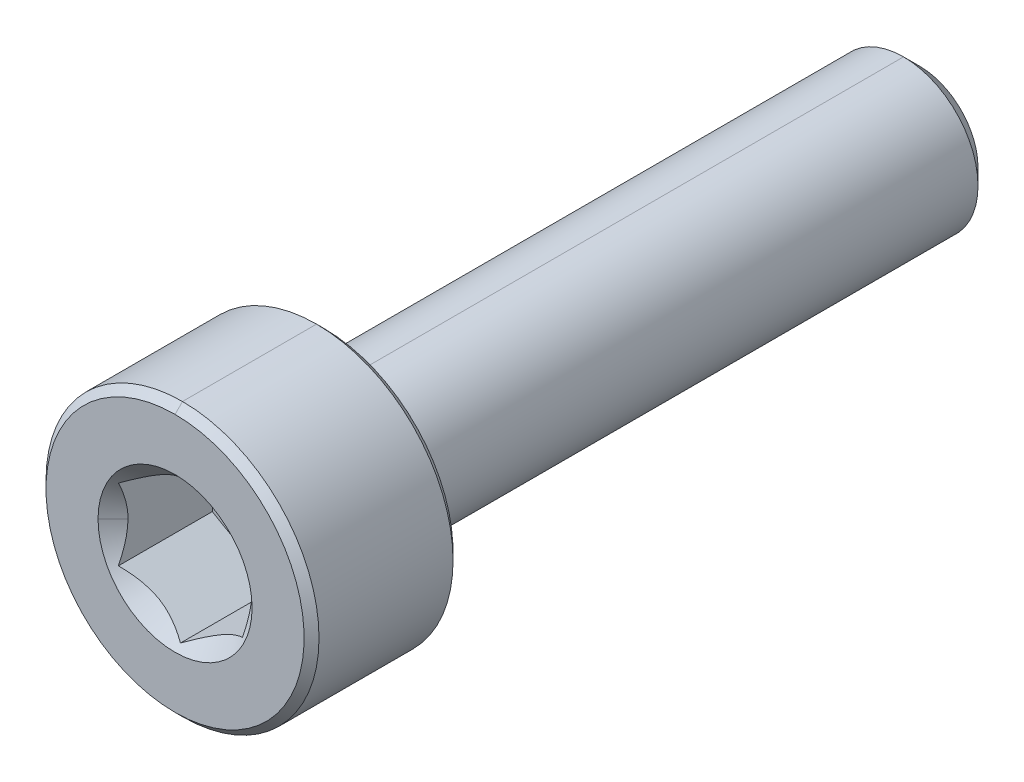
ISO-10303-21;
HEADER;
FILE_DESCRIPTION(('STEP AP214'),'2;1');
FILE_NAME('part.step','',(''),(''),'','','');
FILE_SCHEMA(('AUTOMOTIVE_DESIGN { 1 0 10303 214 1 1 1 1 }'));
ENDSEC;
DATA;
#1=APPLICATION_CONTEXT('core data for automotive mechanical design processes');
#2=APPLICATION_PROTOCOL_DEFINITION('international standard','automotive_design',2000,#1);
#3=PRODUCT_CONTEXT('',#1,'mechanical');
#4=PRODUCT('Part','Part','',(#3));
#5=PRODUCT_RELATED_PRODUCT_CATEGORY('part','',(#4));
#6=PRODUCT_DEFINITION_FORMATION('','',#4);
#7=PRODUCT_DEFINITION_CONTEXT('part definition',#1,'design');
#8=PRODUCT_DEFINITION('design','',#6,#7);
#9=PRODUCT_DEFINITION_SHAPE('','',#8);
#10=(LENGTH_UNIT() NAMED_UNIT(*) SI_UNIT(.MILLI.,.METRE.));
#11=(NAMED_UNIT(*) PLANE_ANGLE_UNIT() SI_UNIT($,.RADIAN.));
#12=(NAMED_UNIT(*) SI_UNIT($,.STERADIAN.) SOLID_ANGLE_UNIT());
#13=UNCERTAINTY_MEASURE_WITH_UNIT(LENGTH_MEASURE(1.E-05),#10,'distance_accuracy_value','');
#14=(GEOMETRIC_REPRESENTATION_CONTEXT(3) GLOBAL_UNCERTAINTY_ASSIGNED_CONTEXT((#13)) GLOBAL_UNIT_ASSIGNED_CONTEXT((#10,
#11,#12)) REPRESENTATION_CONTEXT('',''));
#15=CARTESIAN_POINT('',(0.,0.,0.));
#16=DIRECTION('',(0.,0.,1.));
#17=DIRECTION('',(1.,0.,0.));
#18=AXIS2_PLACEMENT_3D('',#15,#16,#17);
#19=CARTESIAN_POINT('',(1.25,-0.721687836487032,0.681186920870134));
#20=DIRECTION('',(1.,0.,0.));
#21=DIRECTION('',(0.,-1.,0.));
#22=AXIS2_PLACEMENT_3D('',#19,#20,#21);
#23=PLANE('',#22);
#24=DIRECTION('',(0.,0.,1.));
#25=VECTOR('',#24,1.);
#26=CARTESIAN_POINT('',(1.25,-0.721687836487032,0.681186920870134));
#27=LINE('',#26,#25);
#28=CARTESIAN_POINT('',(1.25,-0.721687836487032,5.5));
#29=VERTEX_POINT('',#28);
#30=CARTESIAN_POINT('',(1.25,-0.721687836487032,7.39174682452695));
#31=VERTEX_POINT('',#30);
#32=EDGE_CURVE('E281',#29,#31,#27,.T.);
#33=ORIENTED_EDGE('',*,*,#32,.T.);
#34=CARTESIAN_POINT('',(1.25,-0.721687836487032,7.39174682452694));
#35=CARTESIAN_POINT('',(1.25,-0.334936490538908,7.19837115155288));
#36=CARTESIAN_POINT('',(1.25,0.,7.19837115155288));
#37=B_SPLINE_CURVE_WITH_KNOTS('',2,(#34,#35,#36),.UNSPECIFIED.,.F.,.F.,(3,3),(0.,1.),.UNSPECIFIED.);
#38=CARTESIAN_POINT('',(1.25,0.,7.19837115155288));
#39=VERTEX_POINT('',#38);
#40=EDGE_CURVE('E338',#31,#39,#37,.T.);
#41=ORIENTED_EDGE('',*,*,#40,.T.);
#42=CARTESIAN_POINT('',(1.25,0.,7.19837115155288));
#43=CARTESIAN_POINT('',(1.25,0.18080910604686,7.19837115155288));
#44=CARTESIAN_POINT('',(1.25,0.371449563482302,7.25239368901567));
#45=CARTESIAN_POINT('',(1.25,0.53655435705269,7.29918008480977));
#46=CARTESIAN_POINT('',(1.25,0.721687836487032,7.39174682452694));
#47=B_SPLINE_CURVE_WITH_KNOTS('',2,(#42,#43,#44,#45,#46),.UNSPECIFIED.,.F.,.F.,(3,2,3),(0.,0.5,
1.),.UNSPECIFIED.);
#48=CARTESIAN_POINT('',(1.25,0.721687836487032,7.39174682452695));
#49=VERTEX_POINT('',#48);
#50=EDGE_CURVE('E550',#39,#49,#47,.T.);
#51=ORIENTED_EDGE('',*,*,#50,.T.);
#52=DIRECTION('',(0.,0.,1.));
#53=VECTOR('',#52,1.);
#54=CARTESIAN_POINT('',(1.25,0.721687836487032,0.681186920870134));
#55=LINE('',#54,#53);
#56=CARTESIAN_POINT('',(1.25,0.721687836487032,5.5));
#57=VERTEX_POINT('',#56);
#58=EDGE_CURVE('E10',#57,#49,#55,.T.);
#59=ORIENTED_EDGE('',*,*,#58,.F.);
#60=DIRECTION('',(0.,1.,0.));
#61=VECTOR('',#60,1.);
#62=CARTESIAN_POINT('',(1.25,-0.721687836487032,5.5));
#63=LINE('',#62,#61);
#64=EDGE_CURVE('E541',#29,#57,#63,.T.);
#65=ORIENTED_EDGE('',*,*,#64,.F.);
#66=EDGE_LOOP('',(#33,#41,#51,#59,#65));
#67=FACE_BOUND('',#66,.T.);
#68=ADVANCED_FACE('F16',(#67),#23,.F.);
#69=CARTESIAN_POINT('',(1.25,0.721687836487032,0.681186920870134));
#70=DIRECTION('',(0.5,0.866025403784439,0.));
#71=DIRECTION('',(0.,0.,-1.));
#72=AXIS2_PLACEMENT_3D('',#69,#70,#71);
#73=PLANE('',#72);
#74=ORIENTED_EDGE('',*,*,#58,.T.);
#75=CARTESIAN_POINT('',(1.25,0.721687836487032,7.39174682452694));
#76=CARTESIAN_POINT('',(0.916560687277689,0.914199113445662,7.19923554756831));
#77=CARTESIAN_POINT('',(0.627302735621754,1.08120226969946,7.19837397959836));
#78=CARTESIAN_POINT('',(0.336432191070494,1.24913645689546,7.19750760844711));
#79=CARTESIAN_POINT('',(0.,1.44337567297406,7.39174682452694));
#80=B_SPLINE_CURVE_WITH_KNOTS('',2,(#75,#76,#77,#78,#79),.UNSPECIFIED.,.F.,.F.,(3,2,3),(0.,0.5,
1.),.UNSPECIFIED.);
#81=CARTESIAN_POINT('',(0.,1.44337567297406,7.39174682452695));
#82=VERTEX_POINT('',#81);
#83=EDGE_CURVE('E564',#49,#82,#80,.T.);
#84=ORIENTED_EDGE('',*,*,#83,.T.);
#85=DIRECTION('',(0.,0.,1.));
#86=VECTOR('',#85,1.);
#87=CARTESIAN_POINT('',(0.,1.44337567297406,0.681186920870134));
#88=LINE('',#87,#86);
#89=CARTESIAN_POINT('',(0.,1.44337567297406,5.5));
#90=VERTEX_POINT('',#89);
#91=EDGE_CURVE('E29',#90,#82,#88,.T.);
#92=ORIENTED_EDGE('',*,*,#91,.F.);
#93=DIRECTION('',(-0.866025403784439,0.5,0.));
#94=VECTOR('',#93,1.);
#95=CARTESIAN_POINT('',(1.25,0.721687836487032,5.5));
#96=LINE('',#95,#94);
#97=EDGE_CURVE('E545',#57,#90,#96,.T.);
#98=ORIENTED_EDGE('',*,*,#97,.F.);
#99=EDGE_LOOP('',(#74,#84,#92,#98));
#100=FACE_BOUND('',#99,.T.);
#101=ADVANCED_FACE('F18',(#100),#73,.F.);
#102=CARTESIAN_POINT('',(0.,1.44337567297406,0.681186920870134));
#103=DIRECTION('',(-0.5,0.866025403784439,0.));
#104=DIRECTION('',(0.,0.,1.));
#105=AXIS2_PLACEMENT_3D('',#102,#103,#104);
#106=PLANE('',#105);
#107=ORIENTED_EDGE('',*,*,#91,.T.);
#108=CARTESIAN_POINT('',(0.,1.44337567297406,7.39174682452694));
#109=CARTESIAN_POINT('',(-0.333439312722313,1.25086439601543,7.19923554756831));
#110=CARTESIAN_POINT('',(-0.622697264378245,1.08386123976164,7.19837397959836));
#111=CARTESIAN_POINT('',(-0.913567808929512,0.915927052565634,7.19750760844711));
#112=CARTESIAN_POINT('',(-1.25,0.721687836487032,7.39174682452694));
#113=B_SPLINE_CURVE_WITH_KNOTS('',2,(#108,#109,#110,#111,#112),.UNSPECIFIED.,.F.,.F.,(3,2,3),
(0.,0.5,1.),.UNSPECIFIED.);
#114=CARTESIAN_POINT('',(-1.25,0.721687836487032,7.39174682452695));
#115=VERTEX_POINT('',#114);
#116=EDGE_CURVE('E185',#82,#115,#113,.T.);
#117=ORIENTED_EDGE('',*,*,#116,.T.);
#118=DIRECTION('',(0.,0.,1.));
#119=VECTOR('',#118,1.);
#120=CARTESIAN_POINT('',(-1.25,0.721687836487032,0.681186920870134));
#121=LINE('',#120,#119);
#122=CARTESIAN_POINT('',(-1.25,0.721687836487032,5.5));
#123=VERTEX_POINT('',#122);
#124=EDGE_CURVE('E54',#123,#115,#121,.T.);
#125=ORIENTED_EDGE('',*,*,#124,.F.);
#126=DIRECTION('',(-0.866025403784439,-0.5,0.));
#127=VECTOR('',#126,1.);
#128=CARTESIAN_POINT('',(0.,1.44337567297406,5.5));
#129=LINE('',#128,#127);
#130=EDGE_CURVE('E488',#90,#123,#129,.T.);
#131=ORIENTED_EDGE('',*,*,#130,.F.);
#132=EDGE_LOOP('',(#107,#117,#125,#131));
#133=FACE_BOUND('',#132,.T.);
#134=ADVANCED_FACE('F220',(#133),#106,.F.);
#135=CARTESIAN_POINT('',(-1.25,0.721687836487032,0.681186920870134));
#136=DIRECTION('',(-1.,0.,0.));
#137=DIRECTION('',(0.,1.,0.));
#138=AXIS2_PLACEMENT_3D('',#135,#136,#137);
#139=PLANE('',#138);
#140=ORIENTED_EDGE('',*,*,#124,.T.);
#141=CARTESIAN_POINT('',(-1.25,0.721687836487032,7.39174682452694));
#142=CARTESIAN_POINT('',(-1.25,0.538824359635312,7.30031508610108));
#143=CARTESIAN_POINT('',(-1.25,0.371449563482303,7.25239368901567));
#144=CARTESIAN_POINT('',(-1.25,0.18276534838339,7.19837115155288));
#145=CARTESIAN_POINT('',(-1.25,0.,7.19837115155288));
#146=B_SPLINE_CURVE_WITH_KNOTS('',2,(#141,#142,#143,#144,#145),.UNSPECIFIED.,.F.,.F.,(3,2,3),
(0.,0.5,1.),.UNSPECIFIED.);
#147=CARTESIAN_POINT('',(-1.25,0.,7.19837115155288));
#148=VERTEX_POINT('',#147);
#149=EDGE_CURVE('E174',#115,#148,#146,.T.);
#150=ORIENTED_EDGE('',*,*,#149,.T.);
#151=CARTESIAN_POINT('',(-1.25,0.,7.19837115155288));
#152=CARTESIAN_POINT('',(-1.25,-0.334936490538908,7.19837115155288));
#153=CARTESIAN_POINT('',(-1.25,-0.721687836487032,7.39174682452694));
#154=B_SPLINE_CURVE_WITH_KNOTS('',2,(#151,#152,#153),.UNSPECIFIED.,.F.,.F.,(3,3),(0.,1.),.UNSPECIFIED.);
#155=CARTESIAN_POINT('',(-1.25,-0.721687836487032,7.39174682452695));
#156=VERTEX_POINT('',#155);
#157=EDGE_CURVE('E179',#148,#156,#154,.T.);
#158=ORIENTED_EDGE('',*,*,#157,.T.);
#159=DIRECTION('',(0.,0.,1.));
#160=VECTOR('',#159,1.);
#161=CARTESIAN_POINT('',(-1.25,-0.721687836487032,0.681186920870134));
#162=LINE('',#161,#160);
#163=CARTESIAN_POINT('',(-1.25,-0.721687836487033,5.5));
#164=VERTEX_POINT('',#163);
#165=EDGE_CURVE('E43',#164,#156,#162,.T.);
#166=ORIENTED_EDGE('',*,*,#165,.F.);
#167=DIRECTION('',(0.,-1.,0.));
#168=VECTOR('',#167,1.);
#169=CARTESIAN_POINT('',(-1.25,0.721687836487032,5.5));
#170=LINE('',#169,#168);
#171=EDGE_CURVE('E484',#123,#164,#170,.T.);
#172=ORIENTED_EDGE('',*,*,#171,.F.);
#173=EDGE_LOOP('',(#140,#150,#158,#166,#172));
#174=FACE_BOUND('',#173,.T.);
#175=ADVANCED_FACE('F177',(#174),#139,.F.);
#176=CARTESIAN_POINT('',(-1.25,-0.721687836487032,0.681186920870134));
#177=DIRECTION('',(-0.5,-0.866025403784439,0.));
#178=DIRECTION('',(-0.866025403784439,0.5,0.));
#179=AXIS2_PLACEMENT_3D('',#176,#177,#178);
#180=PLANE('',#179);
#181=ORIENTED_EDGE('',*,*,#165,.T.);
#182=CARTESIAN_POINT('',(-1.25,-0.721687836487032,7.39174682452695));
#183=CARTESIAN_POINT('',(-0.916560687279091,-0.914199113444852,7.19923554756913));
#184=CARTESIAN_POINT('',(-0.627302735621754,-1.08120226969946,7.19837397959837));
#185=CARTESIAN_POINT('',(-0.336432191071902,-1.24913645689465,7.19750760844631));
#186=CARTESIAN_POINT('',(0.,-1.44337567297406,7.39174682452695));
#187=B_SPLINE_CURVE_WITH_KNOTS('',2,(#182,#183,#184,#185,#186),.UNSPECIFIED.,.F.,.F.,(3,2,3),
(0.,0.5,1.),.UNSPECIFIED.);
#188=CARTESIAN_POINT('',(0.,-1.44337567297406,7.39174682452695));
#189=VERTEX_POINT('',#188);
#190=EDGE_CURVE('E203',#156,#189,#187,.T.);
#191=ORIENTED_EDGE('',*,*,#190,.T.);
#192=DIRECTION('',(0.,0.,1.));
#193=VECTOR('',#192,1.);
#194=CARTESIAN_POINT('',(0.,-1.44337567297406,0.681186920870134));
#195=LINE('',#194,#193);
#196=CARTESIAN_POINT('',(0.,-1.44337567297406,5.5));
#197=VERTEX_POINT('',#196);
#198=EDGE_CURVE('E287',#197,#189,#195,.T.);
#199=ORIENTED_EDGE('',*,*,#198,.F.);
#200=DIRECTION('',(0.866025403784439,-0.5,0.));
#201=VECTOR('',#200,1.);
#202=CARTESIAN_POINT('',(-1.25,-0.721687836487032,5.5));
#203=LINE('',#202,#201);
#204=EDGE_CURVE('E297',#164,#197,#203,.T.);
#205=ORIENTED_EDGE('',*,*,#204,.F.);
#206=EDGE_LOOP('',(#181,#191,#199,#205));
#207=FACE_BOUND('',#206,.T.);
#208=ADVANCED_FACE('F219',(#207),#180,.F.);
#209=CARTESIAN_POINT('',(0.,-1.44337567297406,0.681186920870134));
#210=DIRECTION('',(0.5,-0.866025403784439,0.));
#211=DIRECTION('',(0.,0.,-1.));
#212=AXIS2_PLACEMENT_3D('',#209,#210,#211);
#213=PLANE('',#212);
#214=ORIENTED_EDGE('',*,*,#198,.T.);
#215=CARTESIAN_POINT('',(0.,-1.44337567297406,7.39174682452694));
#216=CARTESIAN_POINT('',(0.333439312720909,-1.25086439601624,7.19923554756912));
#217=CARTESIAN_POINT('',(0.622697264378245,-1.08386123976164,7.19837397959836));
#218=CARTESIAN_POINT('',(0.913567808928101,-0.915927052566449,7.1975076084463));
#219=CARTESIAN_POINT('',(1.25,-0.721687836487032,7.39174682452694));
#220=B_SPLINE_CURVE_WITH_KNOTS('',2,(#215,#216,#217,#218,#219),.UNSPECIFIED.,.F.,.F.,(3,2,3),
(0.,0.5,1.),.UNSPECIFIED.);
#221=EDGE_CURVE('E303',#189,#31,#220,.T.);
#222=ORIENTED_EDGE('',*,*,#221,.T.);
#223=ORIENTED_EDGE('',*,*,#32,.F.);
#224=DIRECTION('',(0.866025403784438,0.5,0.));
#225=VECTOR('',#224,1.);
#226=CARTESIAN_POINT('',(0.,-1.44337567297406,5.5));
#227=LINE('',#226,#225);
#228=EDGE_CURVE('E546',#197,#29,#227,.T.);
#229=ORIENTED_EDGE('',*,*,#228,.F.);
#230=EDGE_LOOP('',(#214,#222,#223,#229));
#231=FACE_BOUND('',#230,.T.);
#232=ADVANCED_FACE('F309',(#231),#213,.F.);
#233=CARTESIAN_POINT('',(0.,2.6,5.5));
#234=DIRECTION('',(0.,0.,-1.));
#235=DIRECTION('',(-1.,0.,0.));
#236=AXIS2_PLACEMENT_3D('',#233,#234,#235);
#237=PLANE('',#236);
#238=ORIENTED_EDGE('',*,*,#228,.T.);
#239=ORIENTED_EDGE('',*,*,#64,.T.);
#240=ORIENTED_EDGE('',*,*,#97,.T.);
#241=ORIENTED_EDGE('',*,*,#130,.T.);
#242=ORIENTED_EDGE('',*,*,#171,.T.);
#243=ORIENTED_EDGE('',*,*,#204,.T.);
#244=EDGE_LOOP('',(#238,#239,#240,#241,#242,#243));
#245=FACE_BOUND('',#244,.T.);
#246=ADVANCED_FACE('F247',(#245),#237,.F.);
#247=CARTESIAN_POINT('',(0.,0.,7.5));
#248=DIRECTION('',(0.,0.,1.));
#249=DIRECTION('',(1.,0.,0.));
#250=AXIS2_PLACEMENT_3D('',#247,#248,#249);
#251=CONICAL_SURFACE('',#250,1.55162884844712,0.78539816339745);
#252=DIRECTION('',(-0.707106781186549,0.,0.707106781186546));
#253=VECTOR('',#252,1.);
#254=CARTESIAN_POINT('',(-1.55162884844712,0.,7.5));
#255=LINE('',#254,#253);
#256=CARTESIAN_POINT('',(-1.55162884844712,0.,7.5));
#257=VERTEX_POINT('',#256);
#258=EDGE_CURVE('E190',#148,#257,#255,.T.);
#259=ORIENTED_EDGE('',*,*,#258,.F.);
#260=ORIENTED_EDGE('',*,*,#149,.F.);
#261=ORIENTED_EDGE('',*,*,#116,.F.);
#262=ORIENTED_EDGE('',*,*,#83,.F.);
#263=ORIENTED_EDGE('',*,*,#50,.F.);
#264=DIRECTION('',(0.707106781186549,0.,0.707106781186546));
#265=VECTOR('',#264,1.);
#266=CARTESIAN_POINT('',(1.55162884844712,0.,7.5));
#267=LINE('',#266,#265);
#268=CARTESIAN_POINT('',(1.55162884844712,0.,7.5));
#269=VERTEX_POINT('',#268);
#270=EDGE_CURVE('E456',#39,#269,#267,.T.);
#271=ORIENTED_EDGE('',*,*,#270,.T.);
#272=CARTESIAN_POINT('',(0.,0.,7.5));
#273=DIRECTION('',(0.,0.,1.));
#274=DIRECTION('',(1.,0.,0.));
#275=AXIS2_PLACEMENT_3D('',#272,#273,#274);
#276=CIRCLE('',#275,1.55162884844712);
#277=EDGE_CURVE('E186',#269,#257,#276,.T.);
#278=ORIENTED_EDGE('',*,*,#277,.T.);
#279=EDGE_LOOP('',(#259,#260,#261,#262,#263,#271,#278));
#280=FACE_BOUND('',#279,.T.);
#281=ADVANCED_FACE('F191',(#280),#251,.F.);
#282=CARTESIAN_POINT('',(0.,0.,7.5));
#283=DIRECTION('',(0.,0.,1.));
#284=DIRECTION('',(0.,-1.,0.));
#285=AXIS2_PLACEMENT_3D('',#282,#283,#284);
#286=PLANE('',#285);
#287=ORIENTED_EDGE('',*,*,#277,.F.);
#288=CARTESIAN_POINT('',(0.,0.,7.5));
#289=DIRECTION('',(0.,0.,1.));
#290=DIRECTION('',(1.,0.,0.));
#291=AXIS2_PLACEMENT_3D('',#288,#289,#290);
#292=CIRCLE('',#291,1.55162884844712);
#293=EDGE_CURVE('E197',#257,#269,#292,.T.);
#294=ORIENTED_EDGE('',*,*,#293,.F.);
#295=EDGE_LOOP('',(#287,#294));
#296=FACE_BOUND('',#295,.T.);
#297=CARTESIAN_POINT('',(0.,0.,7.5));
#298=DIRECTION('',(0.,0.,-1.));
#299=DIRECTION('',(0.,1.,0.));
#300=AXIS2_PLACEMENT_3D('',#297,#298,#299);
#301=CIRCLE('',#300,2.6);
#302=CARTESIAN_POINT('',(0.,2.6,7.5));
#303=VERTEX_POINT('',#302);
#304=CARTESIAN_POINT('',(0.,-2.6,7.5));
#305=VERTEX_POINT('',#304);
#306=EDGE_CURVE('E444',#303,#305,#301,.T.);
#307=ORIENTED_EDGE('',*,*,#306,.F.);
#308=CARTESIAN_POINT('',(0.,0.,7.5));
#309=DIRECTION('',(0.,0.,-1.));
#310=DIRECTION('',(0.,1.,0.));
#311=AXIS2_PLACEMENT_3D('',#308,#309,#310);
#312=CIRCLE('',#311,2.6);
#313=EDGE_CURVE('E491',#305,#303,#312,.T.);
#314=ORIENTED_EDGE('',*,*,#313,.F.);
#315=EDGE_LOOP('',(#307,#314));
#316=FACE_BOUND('',#315,.T.);
#317=ADVANCED_FACE('F246',(#296,#316),#286,.T.);
#318=CARTESIAN_POINT('',(0.,0.,7.35));
#319=DIRECTION('',(0.,0.,-1.));
#320=DIRECTION('',(0.,1.,0.));
#321=AXIS2_PLACEMENT_3D('',#318,#319,#320);
#322=CONICAL_SURFACE('',#321,2.75,0.785398163397446);
#323=DIRECTION('',(0.,-0.707106781186546,-0.70710678118655));
#324=VECTOR('',#323,1.);
#325=CARTESIAN_POINT('',(0.,-2.75,7.35));
#326=LINE('',#325,#324);
#327=CARTESIAN_POINT('',(0.,-2.75,7.35));
#328=VERTEX_POINT('',#327);
#329=EDGE_CURVE('E439',#305,#328,#326,.T.);
#330=ORIENTED_EDGE('',*,*,#329,.F.);
#331=ORIENTED_EDGE('',*,*,#313,.T.);
#332=DIRECTION('',(0.,0.707106781186546,-0.70710678118655));
#333=VECTOR('',#332,1.);
#334=CARTESIAN_POINT('',(0.,2.75,7.35));
#335=LINE('',#334,#333);
#336=CARTESIAN_POINT('',(0.,2.75,7.35));
#337=VERTEX_POINT('',#336);
#338=EDGE_CURVE('E430',#303,#337,#335,.T.);
#339=ORIENTED_EDGE('',*,*,#338,.T.);
#340=CARTESIAN_POINT('',(0.,0.,7.35));
#341=DIRECTION('',(0.,0.,-1.));
#342=DIRECTION('',(0.,1.,0.));
#343=AXIS2_PLACEMENT_3D('',#340,#341,#342);
#344=CIRCLE('',#343,2.75);
#345=EDGE_CURVE('E423',#328,#337,#344,.T.);
#346=ORIENTED_EDGE('',*,*,#345,.F.);
#347=EDGE_LOOP('',(#330,#331,#339,#346));
#348=FACE_BOUND('',#347,.T.);
#349=ADVANCED_FACE('F369',(#348),#322,.T.);
#350=CARTESIAN_POINT('',(0.,0.,-7.5));
#351=DIRECTION('',(0.,0.,-1.));
#352=DIRECTION('',(0.,1.,0.));
#353=AXIS2_PLACEMENT_3D('',#350,#351,#352);
#354=CYLINDRICAL_SURFACE('',#353,2.75);
#355=DIRECTION('',(0.,0.,-1.));
#356=VECTOR('',#355,1.);
#357=CARTESIAN_POINT('',(0.,-2.75,-7.5));
#358=LINE('',#357,#356);
#359=CARTESIAN_POINT('',(0.,-2.75,4.65));
#360=VERTEX_POINT('',#359);
#361=EDGE_CURVE('E420',#328,#360,#358,.T.);
#362=ORIENTED_EDGE('',*,*,#361,.F.);
#363=ORIENTED_EDGE('',*,*,#345,.T.);
#364=DIRECTION('',(0.,0.,-1.));
#365=VECTOR('',#364,1.);
#366=CARTESIAN_POINT('',(0.,2.75,-7.5));
#367=LINE('',#366,#365);
#368=CARTESIAN_POINT('',(0.,2.75,4.65));
#369=VERTEX_POINT('',#368);
#370=EDGE_CURVE('E435',#337,#369,#367,.T.);
#371=ORIENTED_EDGE('',*,*,#370,.T.);
#372=CARTESIAN_POINT('',(0.,0.,4.65));
#373=DIRECTION('',(0.,0.,-1.));
#374=DIRECTION('',(0.,1.,0.));
#375=AXIS2_PLACEMENT_3D('',#372,#373,#374);
#376=CIRCLE('',#375,2.75);
#377=EDGE_CURVE('E425',#360,#369,#376,.T.);
#378=ORIENTED_EDGE('',*,*,#377,.F.);
#379=EDGE_LOOP('',(#362,#363,#371,#378));
#380=FACE_BOUND('',#379,.T.);
#381=ADVANCED_FACE('F372',(#380),#354,.T.);
#382=CARTESIAN_POINT('',(0.,0.,4.5));
#383=DIRECTION('',(0.,0.,1.));
#384=DIRECTION('',(0.,-1.,0.));
#385=AXIS2_PLACEMENT_3D('',#382,#383,#384);
#386=CONICAL_SURFACE('',#385,2.6,0.785398163397451);
#387=DIRECTION('',(0.,0.70710678118655,0.707106781186546));
#388=VECTOR('',#387,1.);
#389=CARTESIAN_POINT('',(0.,2.6,4.5));
#390=LINE('',#389,#388);
#391=CARTESIAN_POINT('',(0.,2.6,4.5));
#392=VERTEX_POINT('',#391);
#393=EDGE_CURVE('E468',#392,#369,#390,.T.);
#394=ORIENTED_EDGE('',*,*,#393,.F.);
#395=CARTESIAN_POINT('',(0.,0.,4.5));
#396=DIRECTION('',(0.,0.,-1.));
#397=DIRECTION('',(0.,1.,0.));
#398=AXIS2_PLACEMENT_3D('',#395,#396,#397);
#399=CIRCLE('',#398,2.6);
#400=CARTESIAN_POINT('',(0.,-2.6,4.5));
#401=VERTEX_POINT('',#400);
#402=EDGE_CURVE('E521',#401,#392,#399,.T.);
#403=ORIENTED_EDGE('',*,*,#402,.F.);
#404=DIRECTION('',(0.,-0.70710678118655,0.707106781186546));
#405=VECTOR('',#404,1.);
#406=CARTESIAN_POINT('',(0.,-2.6,4.5));
#407=LINE('',#406,#405);
#408=EDGE_CURVE('E472',#401,#360,#407,.T.);
#409=ORIENTED_EDGE('',*,*,#408,.T.);
#410=ORIENTED_EDGE('',*,*,#377,.T.);
#411=EDGE_LOOP('',(#394,#403,#409,#410));
#412=FACE_BOUND('',#411,.T.);
#413=ADVANCED_FACE('F248',(#412),#386,.T.);
#414=CARTESIAN_POINT('',(0.,2.6,4.5));
#415=DIRECTION('',(0.,0.,-1.));
#416=DIRECTION('',(-1.,0.,0.));
#417=AXIS2_PLACEMENT_3D('',#414,#415,#416);
#418=PLANE('',#417);
#419=CARTESIAN_POINT('',(0.,0.,4.5));
#420=DIRECTION('',(0.,0.,-1.));
#421=DIRECTION('',(0.,1.,0.));
#422=AXIS2_PLACEMENT_3D('',#419,#420,#421);
#423=CIRCLE('',#422,1.65);
#424=CARTESIAN_POINT('',(0.,1.65,4.5));
#425=VERTEX_POINT('',#424);
#426=CARTESIAN_POINT('',(0.,-1.65,4.5));
#427=VERTEX_POINT('',#426);
#428=EDGE_CURVE('E465',#425,#427,#423,.T.);
#429=ORIENTED_EDGE('',*,*,#428,.F.);
#430=CARTESIAN_POINT('',(0.,0.,4.5));
#431=DIRECTION('',(0.,0.,-1.));
#432=DIRECTION('',(0.,1.,0.));
#433=AXIS2_PLACEMENT_3D('',#430,#431,#432);
#434=CIRCLE('',#433,1.65);
#435=EDGE_CURVE('E506',#427,#425,#434,.T.);
#436=ORIENTED_EDGE('',*,*,#435,.F.);
#437=EDGE_LOOP('',(#429,#436));
#438=FACE_BOUND('',#437,.T.);
#439=ORIENTED_EDGE('',*,*,#402,.T.);
#440=CARTESIAN_POINT('',(0.,0.,4.5));
#441=DIRECTION('',(0.,0.,-1.));
#442=DIRECTION('',(0.,1.,0.));
#443=AXIS2_PLACEMENT_3D('',#440,#441,#442);
#444=CIRCLE('',#443,2.6);
#445=EDGE_CURVE('E473',#392,#401,#444,.T.);
#446=ORIENTED_EDGE('',*,*,#445,.T.);
#447=EDGE_LOOP('',(#439,#446));
#448=FACE_BOUND('',#447,.T.);
#449=ADVANCED_FACE('F407',(#438,#448),#418,.T.);
#450=CARTESIAN_POINT('',(0.,0.,4.35));
#451=DIRECTION('',(0.,0.,-1.));
#452=DIRECTION('',(0.,1.,0.));
#453=AXIS2_PLACEMENT_3D('',#450,#451,#452);
#454=TOROIDAL_SURFACE('',#453,1.65,0.15);
#455=CARTESIAN_POINT('',(0.,-1.65,4.35));
#456=DIRECTION('',(1.,0.,0.));
#457=DIRECTION('',(0.,1.,0.));
#458=AXIS2_PLACEMENT_3D('',#455,#456,#457);
#459=CIRCLE('',#458,0.15);
#460=CARTESIAN_POINT('',(0.,-1.5,4.35));
#461=VERTEX_POINT('',#460);
#462=EDGE_CURVE('E502',#461,#427,#459,.T.);
#463=ORIENTED_EDGE('',*,*,#462,.F.);
#464=CARTESIAN_POINT('',(0.,0.,4.35));
#465=DIRECTION('',(0.,0.,-1.));
#466=DIRECTION('',(0.,1.,0.));
#467=AXIS2_PLACEMENT_3D('',#464,#465,#466);
#468=CIRCLE('',#467,1.5);
#469=CARTESIAN_POINT('',(0.,1.5,4.35));
#470=VERTEX_POINT('',#469);
#471=EDGE_CURVE('E462',#470,#461,#468,.T.);
#472=ORIENTED_EDGE('',*,*,#471,.F.);
#473=CARTESIAN_POINT('',(0.,1.65,4.35));
#474=DIRECTION('',(-1.,0.,0.));
#475=DIRECTION('',(0.,0.,1.));
#476=AXIS2_PLACEMENT_3D('',#473,#474,#475);
#477=CIRCLE('',#476,0.15);
#478=EDGE_CURVE('E510',#470,#425,#477,.T.);
#479=ORIENTED_EDGE('',*,*,#478,.T.);
#480=ORIENTED_EDGE('',*,*,#428,.T.);
#481=EDGE_LOOP('',(#463,#472,#479,#480));
#482=FACE_BOUND('',#481,.T.);
#483=ADVANCED_FACE('F403',(#482),#454,.F.);
#484=CARTESIAN_POINT('',(0.,0.,-7.5));
#485=DIRECTION('',(0.,0.,-1.));
#486=DIRECTION('',(0.,1.,0.));
#487=AXIS2_PLACEMENT_3D('',#484,#485,#486);
#488=CYLINDRICAL_SURFACE('',#487,1.5);
#489=DIRECTION('',(0.,0.,-1.));
#490=VECTOR('',#489,1.);
#491=CARTESIAN_POINT('',(0.,-1.5,-7.5));
#492=LINE('',#491,#490);
#493=CARTESIAN_POINT('',(0.,-1.5,-7.17524047358084));
#494=VERTEX_POINT('',#493);
#495=EDGE_CURVE('E457',#461,#494,#492,.T.);
#496=ORIENTED_EDGE('',*,*,#495,.F.);
#497=CARTESIAN_POINT('',(0.,0.,4.35));
#498=DIRECTION('',(0.,0.,-1.));
#499=DIRECTION('',(0.,1.,0.));
#500=AXIS2_PLACEMENT_3D('',#497,#498,#499);
#501=CIRCLE('',#500,1.5);
#502=EDGE_CURVE('E498',#461,#470,#501,.T.);
#503=ORIENTED_EDGE('',*,*,#502,.T.);
#504=DIRECTION('',(0.,0.,-1.));
#505=VECTOR('',#504,1.);
#506=CARTESIAN_POINT('',(0.,1.5,-7.5));
#507=LINE('',#506,#505);
#508=CARTESIAN_POINT('',(0.,1.5,-7.17524047358084));
#509=VERTEX_POINT('',#508);
#510=EDGE_CURVE('E495',#470,#509,#507,.T.);
#511=ORIENTED_EDGE('',*,*,#510,.T.);
#512=CARTESIAN_POINT('',(0.,0.,-7.17524047358084));
#513=DIRECTION('',(0.,0.,-1.));
#514=DIRECTION('',(0.,1.,0.));
#515=AXIS2_PLACEMENT_3D('',#512,#513,#514);
#516=CIRCLE('',#515,1.5);
#517=EDGE_CURVE('E463',#494,#509,#516,.T.);
#518=ORIENTED_EDGE('',*,*,#517,.F.);
#519=EDGE_LOOP('',(#496,#503,#511,#518));
#520=FACE_BOUND('',#519,.T.);
#521=ADVANCED_FACE('F399',(#520),#488,.T.);
#522=CARTESIAN_POINT('',(0.,0.,-7.5));
#523=DIRECTION('',(0.,0.,1.));
#524=DIRECTION('',(0.,-1.,0.));
#525=AXIS2_PLACEMENT_3D('',#522,#523,#524);
#526=CONICAL_SURFACE('',#525,1.17524047358084,0.785398163397448);
#527=DIRECTION('',(0.,0.707106781186547,0.707106781186549));
#528=VECTOR('',#527,1.);
#529=CARTESIAN_POINT('',(0.,1.17524047358084,-7.5));
#530=LINE('',#529,#528);
#531=CARTESIAN_POINT('',(0.,1.17524047358084,-7.5));
#532=VERTEX_POINT('',#531);
#533=EDGE_CURVE('E529',#532,#509,#530,.T.);
#534=ORIENTED_EDGE('',*,*,#533,.F.);
#535=CARTESIAN_POINT('',(0.,0.,-7.5));
#536=DIRECTION('',(0.,0.,-1.));
#537=DIRECTION('',(0.,1.,0.));
#538=AXIS2_PLACEMENT_3D('',#535,#536,#537);
#539=CIRCLE('',#538,1.17524047358084);
#540=CARTESIAN_POINT('',(0.,-1.17524047358084,-7.5));
#541=VERTEX_POINT('',#540);
#542=EDGE_CURVE('E466',#541,#532,#539,.T.);
#543=ORIENTED_EDGE('',*,*,#542,.F.);
#544=DIRECTION('',(0.,-0.707106781186547,0.707106781186549));
#545=VECTOR('',#544,1.);
#546=CARTESIAN_POINT('',(0.,-1.17524047358084,-7.5));
#547=LINE('',#546,#545);
#548=EDGE_CURVE('E452',#541,#494,#547,.T.);
#549=ORIENTED_EDGE('',*,*,#548,.T.);
#550=ORIENTED_EDGE('',*,*,#517,.T.);
#551=EDGE_LOOP('',(#534,#543,#549,#550));
#552=FACE_BOUND('',#551,.T.);
#553=ADVANCED_FACE('F395',(#552),#526,.T.);
#554=CARTESIAN_POINT('',(0.,1.17524047358084,-7.5));
#555=DIRECTION('',(0.,0.,-1.));
#556=DIRECTION('',(-1.,0.,0.));
#557=AXIS2_PLACEMENT_3D('',#554,#555,#556);
#558=PLANE('',#557);
#559=ORIENTED_EDGE('',*,*,#542,.T.);
#560=CARTESIAN_POINT('',(0.,0.,-7.5));
#561=DIRECTION('',(0.,0.,-1.));
#562=DIRECTION('',(0.,1.,0.));
#563=AXIS2_PLACEMENT_3D('',#560,#561,#562);
#564=CIRCLE('',#563,1.17524047358084);
#565=EDGE_CURVE('E525',#532,#541,#564,.T.);
#566=ORIENTED_EDGE('',*,*,#565,.T.);
#567=EDGE_LOOP('',(#559,#566));
#568=FACE_BOUND('',#567,.T.);
#569=ADVANCED_FACE('F391',(#568),#558,.T.);
#570=CARTESIAN_POINT('',(0.,0.,-7.5));
#571=DIRECTION('',(0.,0.,1.));
#572=DIRECTION('',(0.,-1.,0.));
#573=AXIS2_PLACEMENT_3D('',#570,#571,#572);
#574=CONICAL_SURFACE('',#573,1.17524047358084,0.785398163397448);
#575=ORIENTED_EDGE('',*,*,#565,.F.);
#576=ORIENTED_EDGE('',*,*,#533,.T.);
#577=CARTESIAN_POINT('',(0.,0.,-7.17524047358084));
#578=DIRECTION('',(0.,0.,-1.));
#579=DIRECTION('',(0.,1.,0.));
#580=AXIS2_PLACEMENT_3D('',#577,#578,#579);
#581=CIRCLE('',#580,1.5);
#582=EDGE_CURVE('E461',#509,#494,#581,.T.);
#583=ORIENTED_EDGE('',*,*,#582,.T.);
#584=ORIENTED_EDGE('',*,*,#548,.F.);
#585=EDGE_LOOP('',(#575,#576,#583,#584));
#586=FACE_BOUND('',#585,.T.);
#587=ADVANCED_FACE('F381',(#586),#574,.T.);
#588=CARTESIAN_POINT('',(0.,0.,-7.5));
#589=DIRECTION('',(0.,0.,-1.));
#590=DIRECTION('',(0.,1.,0.));
#591=AXIS2_PLACEMENT_3D('',#588,#589,#590);
#592=CYLINDRICAL_SURFACE('',#591,1.5);
#593=ORIENTED_EDGE('',*,*,#471,.T.);
#594=ORIENTED_EDGE('',*,*,#495,.T.);
#595=ORIENTED_EDGE('',*,*,#582,.F.);
#596=ORIENTED_EDGE('',*,*,#510,.F.);
#597=EDGE_LOOP('',(#593,#594,#595,#596));
#598=FACE_BOUND('',#597,.T.);
#599=ADVANCED_FACE('F378',(#598),#592,.T.);
#600=CARTESIAN_POINT('',(0.,0.,4.35));
#601=DIRECTION('',(0.,0.,-1.));
#602=DIRECTION('',(0.,1.,0.));
#603=AXIS2_PLACEMENT_3D('',#600,#601,#602);
#604=TOROIDAL_SURFACE('',#603,1.65,0.15);
#605=ORIENTED_EDGE('',*,*,#502,.F.);
#606=ORIENTED_EDGE('',*,*,#462,.T.);
#607=ORIENTED_EDGE('',*,*,#435,.T.);
#608=ORIENTED_EDGE('',*,*,#478,.F.);
#609=EDGE_LOOP('',(#605,#606,#607,#608));
#610=FACE_BOUND('',#609,.T.);
#611=ADVANCED_FACE('F376',(#610),#604,.F.);
#612=CARTESIAN_POINT('',(0.,0.,4.5));
#613=DIRECTION('',(0.,0.,1.));
#614=DIRECTION('',(0.,-1.,0.));
#615=AXIS2_PLACEMENT_3D('',#612,#613,#614);
#616=CONICAL_SURFACE('',#615,2.6,0.785398163397451);
#617=ORIENTED_EDGE('',*,*,#445,.F.);
#618=ORIENTED_EDGE('',*,*,#393,.T.);
#619=CARTESIAN_POINT('',(0.,0.,4.65));
#620=DIRECTION('',(0.,0.,-1.));
#621=DIRECTION('',(0.,1.,0.));
#622=AXIS2_PLACEMENT_3D('',#619,#620,#621);
#623=CIRCLE('',#622,2.75);
#624=EDGE_CURVE('E429',#369,#360,#623,.T.);
#625=ORIENTED_EDGE('',*,*,#624,.T.);
#626=ORIENTED_EDGE('',*,*,#408,.F.);
#627=EDGE_LOOP('',(#617,#618,#625,#626));
#628=FACE_BOUND('',#627,.T.);
#629=ADVANCED_FACE('F367',(#628),#616,.T.);
#630=CARTESIAN_POINT('',(0.,0.,-7.5));
#631=DIRECTION('',(0.,0.,-1.));
#632=DIRECTION('',(0.,1.,0.));
#633=AXIS2_PLACEMENT_3D('',#630,#631,#632);
#634=CYLINDRICAL_SURFACE('',#633,2.75);
#635=CARTESIAN_POINT('',(0.,0.,7.35));
#636=DIRECTION('',(0.,0.,-1.));
#637=DIRECTION('',(0.,1.,0.));
#638=AXIS2_PLACEMENT_3D('',#635,#636,#637);
#639=CIRCLE('',#638,2.75);
#640=EDGE_CURVE('E433',#337,#328,#639,.T.);
#641=ORIENTED_EDGE('',*,*,#640,.T.);
#642=ORIENTED_EDGE('',*,*,#361,.T.);
#643=ORIENTED_EDGE('',*,*,#624,.F.);
#644=ORIENTED_EDGE('',*,*,#370,.F.);
#645=EDGE_LOOP('',(#641,#642,#643,#644));
#646=FACE_BOUND('',#645,.T.);
#647=ADVANCED_FACE('F363',(#646),#634,.T.);
#648=CARTESIAN_POINT('',(0.,0.,7.35));
#649=DIRECTION('',(0.,0.,-1.));
#650=DIRECTION('',(0.,1.,0.));
#651=AXIS2_PLACEMENT_3D('',#648,#649,#650);
#652=CONICAL_SURFACE('',#651,2.75,0.785398163397446);
#653=ORIENTED_EDGE('',*,*,#306,.T.);
#654=ORIENTED_EDGE('',*,*,#329,.T.);
#655=ORIENTED_EDGE('',*,*,#640,.F.);
#656=ORIENTED_EDGE('',*,*,#338,.F.);
#657=EDGE_LOOP('',(#653,#654,#655,#656));
#658=FACE_BOUND('',#657,.T.);
#659=ADVANCED_FACE('F349',(#658),#652,.T.);
#660=CARTESIAN_POINT('',(0.,0.,7.5));
#661=DIRECTION('',(0.,0.,1.));
#662=DIRECTION('',(1.,0.,0.));
#663=AXIS2_PLACEMENT_3D('',#660,#661,#662);
#664=CONICAL_SURFACE('',#663,1.55162884844712,0.78539816339745);
#665=ORIENTED_EDGE('',*,*,#157,.F.);
#666=ORIENTED_EDGE('',*,*,#258,.T.);
#667=ORIENTED_EDGE('',*,*,#293,.T.);
#668=ORIENTED_EDGE('',*,*,#270,.F.);
#669=ORIENTED_EDGE('',*,*,#40,.F.);
#670=ORIENTED_EDGE('',*,*,#221,.F.);
#671=ORIENTED_EDGE('',*,*,#190,.F.);
#672=EDGE_LOOP('',(#665,#666,#667,#668,#669,#670,#671));
#673=FACE_BOUND('',#672,.T.);
#674=ADVANCED_FACE('F200',(#673),#664,.F.);
#675=CLOSED_SHELL('',(#68,#101,#134,#175,#208,#232,#246,#281,#317,#349,#381,#413,#449,#483,#521,
#553,#569,#587,#599,#611,#629,#647,#659,#674));
#676=MANIFOLD_SOLID_BREP('B1',#675);
#677=ADVANCED_BREP_SHAPE_REPRESENTATION('',(#18,#676),#14);
#678=SHAPE_DEFINITION_REPRESENTATION(#9,#677);
ENDSEC;
END-ISO-10303-21;
